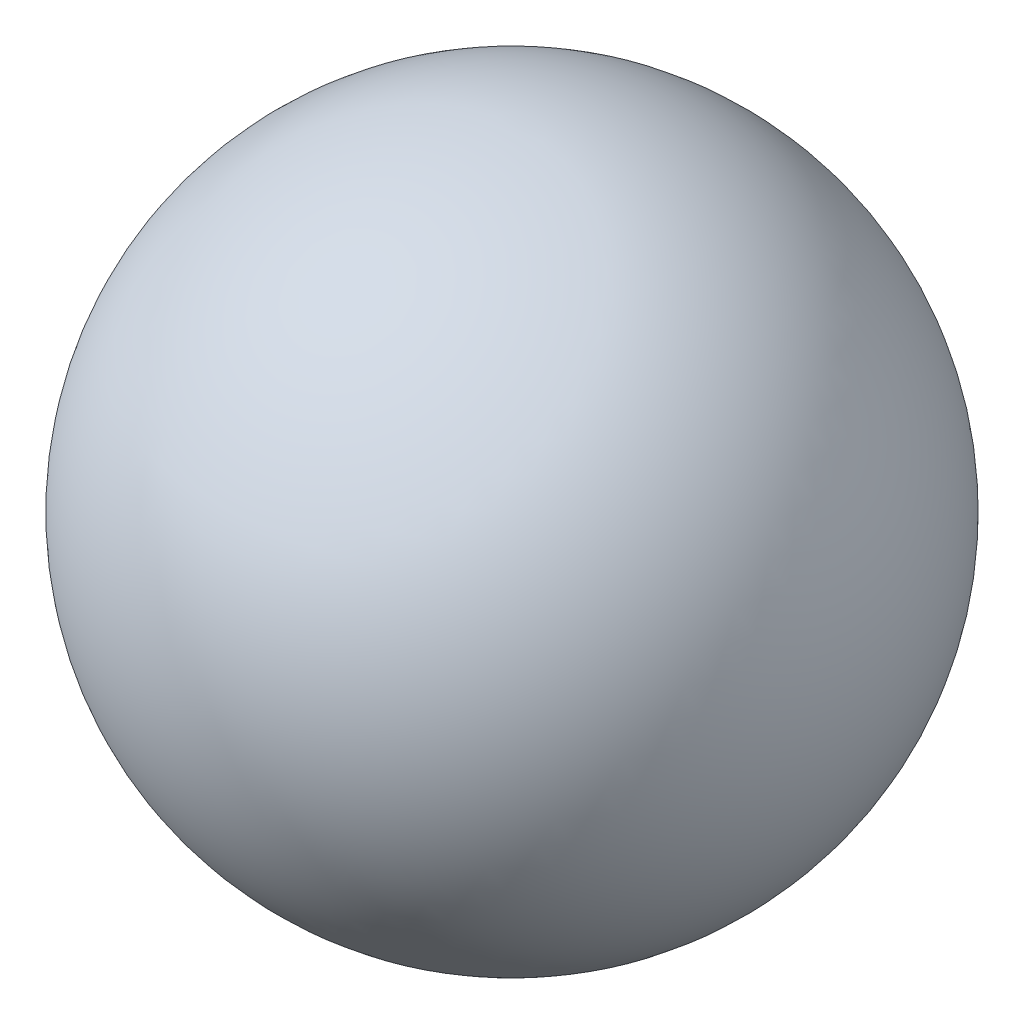
ISO-10303-21;
HEADER;
FILE_DESCRIPTION(('STEP AP214'),'2;1');
FILE_NAME('part.step','',(''),(''),'','','');
FILE_SCHEMA(('AUTOMOTIVE_DESIGN { 1 0 10303 214 1 1 1 1 }'));
ENDSEC;
DATA;
#1=APPLICATION_CONTEXT('core data for automotive mechanical design processes');
#2=APPLICATION_PROTOCOL_DEFINITION('international standard','automotive_design',2000,#1);
#3=PRODUCT_CONTEXT('',#1,'mechanical');
#4=PRODUCT('Part','Part','',(#3));
#5=PRODUCT_RELATED_PRODUCT_CATEGORY('part','',(#4));
#6=PRODUCT_DEFINITION_FORMATION('','',#4);
#7=PRODUCT_DEFINITION_CONTEXT('part definition',#1,'design');
#8=PRODUCT_DEFINITION('design','',#6,#7);
#9=PRODUCT_DEFINITION_SHAPE('','',#8);
#10=(LENGTH_UNIT() NAMED_UNIT(*) SI_UNIT(.MILLI.,.METRE.));
#11=(NAMED_UNIT(*) PLANE_ANGLE_UNIT() SI_UNIT($,.RADIAN.));
#12=(NAMED_UNIT(*) SI_UNIT($,.STERADIAN.) SOLID_ANGLE_UNIT());
#13=UNCERTAINTY_MEASURE_WITH_UNIT(LENGTH_MEASURE(1.E-05),#10,'distance_accuracy_value','');
#14=(GEOMETRIC_REPRESENTATION_CONTEXT(3) GLOBAL_UNCERTAINTY_ASSIGNED_CONTEXT((#13)) GLOBAL_UNIT_ASSIGNED_CONTEXT((#10,
#11,#12)) REPRESENTATION_CONTEXT('',''));
#15=CARTESIAN_POINT('',(0.,0.,0.));
#16=DIRECTION('',(0.,0.,1.));
#17=DIRECTION('',(1.,0.,0.));
#18=AXIS2_PLACEMENT_3D('',#15,#16,#17);
#19=CARTESIAN_POINT('',(0.,0.,0.));
#20=DIRECTION('',(0.,-1.,0.));
#21=DIRECTION('',(-1.,0.,0.));
#22=AXIS2_PLACEMENT_3D('',#19,#20,#21);
#23=SPHERICAL_SURFACE('',#22,11.25);
#24=CARTESIAN_POINT('',(0.,-11.25,0.));
#25=VERTEX_POINT('',#24);
#26=VERTEX_LOOP('',#25);
#27=FACE_BOUND('',#26,.T.);
#28=ADVANCED_FACE('F34',(#27),#23,.T.);
#29=CLOSED_SHELL('',(#28));
#30=MANIFOLD_SOLID_BREP('B2',#29);
#31=ADVANCED_BREP_SHAPE_REPRESENTATION('',(#18,#30),#14);
#32=SHAPE_DEFINITION_REPRESENTATION(#9,#31);
ENDSEC;
END-ISO-10303-21;
